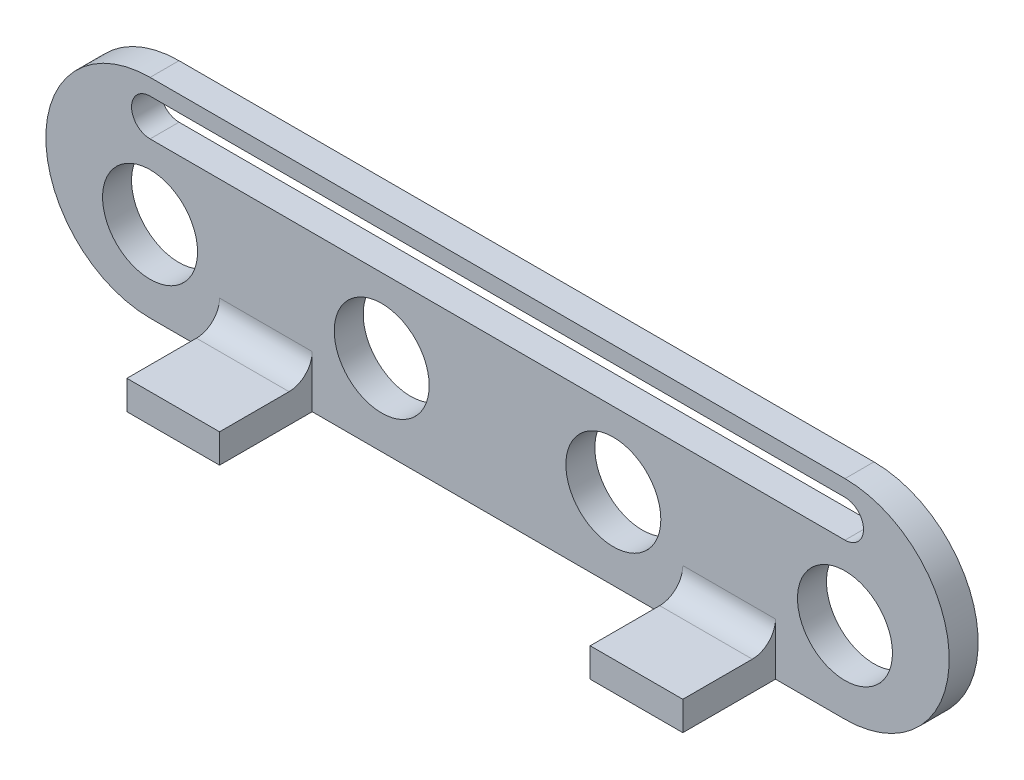
ISO-10303-21;
HEADER;
FILE_DESCRIPTION(('STEP AP214'),'2;1');
FILE_NAME('part.step','',(''),(''),'','','');
FILE_SCHEMA(('AUTOMOTIVE_DESIGN { 1 0 10303 214 1 1 1 1 }'));
ENDSEC;
DATA;
#1=APPLICATION_CONTEXT('core data for automotive mechanical design processes');
#2=APPLICATION_PROTOCOL_DEFINITION('international standard','automotive_design',2000,#1);
#3=PRODUCT_CONTEXT('',#1,'mechanical');
#4=PRODUCT('Part','Part','',(#3));
#5=PRODUCT_RELATED_PRODUCT_CATEGORY('part','',(#4));
#6=PRODUCT_DEFINITION_FORMATION('','',#4);
#7=PRODUCT_DEFINITION_CONTEXT('part definition',#1,'design');
#8=PRODUCT_DEFINITION('design','',#6,#7);
#9=PRODUCT_DEFINITION_SHAPE('','',#8);
#10=(LENGTH_UNIT() NAMED_UNIT(*) SI_UNIT(.MILLI.,.METRE.));
#11=(NAMED_UNIT(*) PLANE_ANGLE_UNIT() SI_UNIT($,.RADIAN.));
#12=(NAMED_UNIT(*) SI_UNIT($,.STERADIAN.) SOLID_ANGLE_UNIT());
#13=UNCERTAINTY_MEASURE_WITH_UNIT(LENGTH_MEASURE(1.E-05),#10,'distance_accuracy_value','');
#14=(GEOMETRIC_REPRESENTATION_CONTEXT(3) GLOBAL_UNCERTAINTY_ASSIGNED_CONTEXT((#13)) GLOBAL_UNIT_ASSIGNED_CONTEXT((#10,
#11,#12)) REPRESENTATION_CONTEXT('',''));
#15=CARTESIAN_POINT('',(0.,0.,0.));
#16=DIRECTION('',(0.,0.,1.));
#17=DIRECTION('',(1.,0.,0.));
#18=AXIS2_PLACEMENT_3D('',#15,#16,#17);
#19=CARTESIAN_POINT('',(-38.1,0.,3.175));
#20=DIRECTION('',(0.,0.,1.));
#21=DIRECTION('',(1.,0.,0.));
#22=AXIS2_PLACEMENT_3D('',#19,#20,#21);
#23=PLANE('',#22);
#24=CARTESIAN_POINT('',(-38.1,7.62,3.175));
#25=DIRECTION('',(0.,0.,1.));
#26=DIRECTION('',(1.,0.,0.));
#27=AXIS2_PLACEMENT_3D('',#24,#25,#26);
#28=CIRCLE('',#27,2.032);
#29=CARTESIAN_POINT('',(-38.1,9.652,3.175));
#30=VERTEX_POINT('',#29);
#31=CARTESIAN_POINT('',(-38.1,5.588,3.175));
#32=VERTEX_POINT('',#31);
#33=EDGE_CURVE('E48',#30,#32,#28,.T.);
#34=ORIENTED_EDGE('',*,*,#33,.F.);
#35=DIRECTION('',(-1.,0.,0.));
#36=VECTOR('',#35,1.);
#37=CARTESIAN_POINT('',(-38.1,9.652,3.175));
#38=LINE('',#37,#36);
#39=CARTESIAN_POINT('',(38.1,9.652,3.175));
#40=VERTEX_POINT('',#39);
#41=EDGE_CURVE('E165',#40,#30,#38,.T.);
#42=ORIENTED_EDGE('',*,*,#41,.F.);
#43=CARTESIAN_POINT('',(38.1,7.62,3.175));
#44=DIRECTION('',(0.,0.,1.));
#45=DIRECTION('',(1.,0.,0.));
#46=AXIS2_PLACEMENT_3D('',#43,#44,#45);
#47=CIRCLE('',#46,2.032);
#48=CARTESIAN_POINT('',(38.1,5.588,3.175));
#49=VERTEX_POINT('',#48);
#50=EDGE_CURVE('E185',#49,#40,#47,.T.);
#51=ORIENTED_EDGE('',*,*,#50,.F.);
#52=DIRECTION('',(1.,0.,0.));
#53=VECTOR('',#52,1.);
#54=CARTESIAN_POINT('',(-38.1,5.588,3.175));
#55=LINE('',#54,#53);
#56=EDGE_CURVE('E179',#32,#49,#55,.T.);
#57=ORIENTED_EDGE('',*,*,#56,.F.);
#58=EDGE_LOOP('',(#34,#42,#51,#57));
#59=FACE_BOUND('',#58,.T.);
#60=CARTESIAN_POINT('',(12.7,-2.54,3.175));
#61=DIRECTION('',(0.,0.,1.));
#62=DIRECTION('',(1.,0.,0.));
#63=AXIS2_PLACEMENT_3D('',#60,#61,#62);
#64=CIRCLE('',#63,5.207);
#65=CARTESIAN_POINT('',(17.907,-2.54,3.175));
#66=VERTEX_POINT('',#65);
#67=EDGE_CURVE('E252',#66,#66,#64,.T.);
#68=ORIENTED_EDGE('',*,*,#67,.F.);
#69=EDGE_LOOP('',(#68));
#70=FACE_BOUND('',#69,.T.);
#71=CARTESIAN_POINT('',(-38.1,-2.54,3.175));
#72=DIRECTION('',(0.,0.,1.));
#73=DIRECTION('',(1.,0.,0.));
#74=AXIS2_PLACEMENT_3D('',#71,#72,#73);
#75=CIRCLE('',#74,5.207);
#76=CARTESIAN_POINT('',(-32.893,-2.54,3.175));
#77=VERTEX_POINT('',#76);
#78=EDGE_CURVE('E264',#77,#77,#75,.T.);
#79=ORIENTED_EDGE('',*,*,#78,.F.);
#80=EDGE_LOOP('',(#79));
#81=FACE_BOUND('',#80,.T.);
#82=CARTESIAN_POINT('',(-12.7,-2.54,3.175));
#83=DIRECTION('',(0.,0.,1.));
#84=DIRECTION('',(1.,0.,0.));
#85=AXIS2_PLACEMENT_3D('',#82,#83,#84);
#86=CIRCLE('',#85,5.207);
#87=CARTESIAN_POINT('',(-7.49300000000001,-2.54,3.175));
#88=VERTEX_POINT('',#87);
#89=EDGE_CURVE('E258',#88,#88,#86,.T.);
#90=ORIENTED_EDGE('',*,*,#89,.F.);
#91=EDGE_LOOP('',(#90));
#92=FACE_BOUND('',#91,.T.);
#93=CARTESIAN_POINT('',(38.1,-2.54,3.175));
#94=DIRECTION('',(0.,0.,1.));
#95=DIRECTION('',(1.,0.,0.));
#96=AXIS2_PLACEMENT_3D('',#93,#94,#95);
#97=CIRCLE('',#96,5.207);
#98=CARTESIAN_POINT('',(43.307,-2.54,3.175));
#99=VERTEX_POINT('',#98);
#100=EDGE_CURVE('E246',#99,#99,#97,.T.);
#101=ORIENTED_EDGE('',*,*,#100,.F.);
#102=EDGE_LOOP('',(#101));
#103=FACE_BOUND('',#102,.T.);
#104=DIRECTION('',(0.,-1.,0.));
#105=VECTOR('',#104,1.);
#106=CARTESIAN_POINT('',(20.32,-8.255,3.175));
#107=LINE('',#106,#105);
#108=CARTESIAN_POINT('',(20.32,-5.715,3.175));
#109=VERTEX_POINT('',#108);
#110=CARTESIAN_POINT('',(20.32,-11.43,3.175));
#111=VERTEX_POINT('',#110);
#112=EDGE_CURVE('E224',#109,#111,#107,.T.);
#113=ORIENTED_EDGE('',*,*,#112,.F.);
#114=DIRECTION('',(-1.,0.,0.));
#115=VECTOR('',#114,1.);
#116=CARTESIAN_POINT('',(-38.1,-5.71499999999999,3.175));
#117=LINE('',#116,#115);
#118=CARTESIAN_POINT('',(30.48,-5.715,3.175));
#119=VERTEX_POINT('',#118);
#120=EDGE_CURVE('E307',#109,#119,#117,.F.);
#121=ORIENTED_EDGE('',*,*,#120,.T.);
#122=DIRECTION('',(0.,1.,0.));
#123=VECTOR('',#122,1.);
#124=CARTESIAN_POINT('',(30.48,-8.255,3.175));
#125=LINE('',#124,#123);
#126=CARTESIAN_POINT('',(30.48,-11.43,3.175));
#127=VERTEX_POINT('',#126);
#128=EDGE_CURVE('E219',#127,#119,#125,.T.);
#129=ORIENTED_EDGE('',*,*,#128,.F.);
#130=DIRECTION('',(1.,0.,0.));
#131=VECTOR('',#130,1.);
#132=CARTESIAN_POINT('',(-38.1,-11.43,3.175));
#133=LINE('',#132,#131);
#134=CARTESIAN_POINT('',(38.1,-11.43,3.175));
#135=VERTEX_POINT('',#134);
#136=EDGE_CURVE('E273',#127,#135,#133,.T.);
#137=ORIENTED_EDGE('',*,*,#136,.T.);
#138=CARTESIAN_POINT('',(38.1,0.,3.175));
#139=DIRECTION('',(0.,0.,1.));
#140=DIRECTION('',(1.,0.,0.));
#141=AXIS2_PLACEMENT_3D('',#138,#139,#140);
#142=CIRCLE('',#141,11.43);
#143=CARTESIAN_POINT('',(38.1,11.43,3.175));
#144=VERTEX_POINT('',#143);
#145=EDGE_CURVE('E277',#135,#144,#142,.T.);
#146=ORIENTED_EDGE('',*,*,#145,.T.);
#147=DIRECTION('',(-1.,0.,0.));
#148=VECTOR('',#147,1.);
#149=CARTESIAN_POINT('',(-38.1,11.43,3.175));
#150=LINE('',#149,#148);
#151=CARTESIAN_POINT('',(-38.1,11.43,3.175));
#152=VERTEX_POINT('',#151);
#153=EDGE_CURVE('E280',#144,#152,#150,.T.);
#154=ORIENTED_EDGE('',*,*,#153,.T.);
#155=CARTESIAN_POINT('',(-38.1,0.,3.175));
#156=DIRECTION('',(0.,0.,1.));
#157=DIRECTION('',(1.,0.,0.));
#158=AXIS2_PLACEMENT_3D('',#155,#156,#157);
#159=CIRCLE('',#158,11.43);
#160=CARTESIAN_POINT('',(-38.1,-11.43,3.175));
#161=VERTEX_POINT('',#160);
#162=EDGE_CURVE('E270',#152,#161,#159,.T.);
#163=ORIENTED_EDGE('',*,*,#162,.T.);
#164=CARTESIAN_POINT('',(-30.48,-11.43,3.175));
#165=VERTEX_POINT('',#164);
#166=EDGE_CURVE('E275',#161,#165,#133,.T.);
#167=ORIENTED_EDGE('',*,*,#166,.T.);
#168=DIRECTION('',(0.,-1.,0.));
#169=VECTOR('',#168,1.);
#170=CARTESIAN_POINT('',(-30.48,-8.255,3.175));
#171=LINE('',#170,#169);
#172=CARTESIAN_POINT('',(-30.48,-5.715,3.175));
#173=VERTEX_POINT('',#172);
#174=EDGE_CURVE('E171',#173,#165,#171,.T.);
#175=ORIENTED_EDGE('',*,*,#174,.F.);
#176=DIRECTION('',(-1.,0.,0.));
#177=VECTOR('',#176,1.);
#178=CARTESIAN_POINT('',(-38.1,-5.715,3.175));
#179=LINE('',#178,#177);
#180=CARTESIAN_POINT('',(-20.32,-5.715,3.175));
#181=VERTEX_POINT('',#180);
#182=EDGE_CURVE('E304',#173,#181,#179,.F.);
#183=ORIENTED_EDGE('',*,*,#182,.T.);
#184=DIRECTION('',(0.,1.,0.));
#185=VECTOR('',#184,1.);
#186=CARTESIAN_POINT('',(-20.32,-8.255,3.175));
#187=LINE('',#186,#185);
#188=CARTESIAN_POINT('',(-20.32,-11.43,3.175));
#189=VERTEX_POINT('',#188);
#190=EDGE_CURVE('E198',#189,#181,#187,.T.);
#191=ORIENTED_EDGE('',*,*,#190,.F.);
#192=EDGE_CURVE('E278',#189,#111,#133,.T.);
#193=ORIENTED_EDGE('',*,*,#192,.T.);
#194=EDGE_LOOP('',(#113,#121,#129,#137,#146,#154,#163,#167,#175,#183,#191,#193));
#195=FACE_BOUND('',#194,.T.);
#196=ADVANCED_FACE('F33',(#59,#70,#81,#92,#103,#195),#23,.T.);
#197=CARTESIAN_POINT('',(-38.1,0.,0.));
#198=DIRECTION('',(0.,0.,1.));
#199=DIRECTION('',(1.,0.,0.));
#200=AXIS2_PLACEMENT_3D('',#197,#198,#199);
#201=PLANE('',#200);
#202=DIRECTION('',(1.,0.,0.));
#203=VECTOR('',#202,1.);
#204=CARTESIAN_POINT('',(-38.1,9.652,0.));
#205=LINE('',#204,#203);
#206=CARTESIAN_POINT('',(-38.1,9.652,0.));
#207=VERTEX_POINT('',#206);
#208=CARTESIAN_POINT('',(38.1,9.652,0.));
#209=VERTEX_POINT('',#208);
#210=EDGE_CURVE('E177',#207,#209,#205,.T.);
#211=ORIENTED_EDGE('',*,*,#210,.F.);
#212=CARTESIAN_POINT('',(-38.1,7.62,0.));
#213=DIRECTION('',(0.,0.,1.));
#214=DIRECTION('',(1.,0.,0.));
#215=AXIS2_PLACEMENT_3D('',#212,#213,#214);
#216=CIRCLE('',#215,2.032);
#217=CARTESIAN_POINT('',(-38.1,5.588,0.));
#218=VERTEX_POINT('',#217);
#219=EDGE_CURVE('E159',#218,#207,#216,.F.);
#220=ORIENTED_EDGE('',*,*,#219,.F.);
#221=DIRECTION('',(-1.,0.,0.));
#222=VECTOR('',#221,1.);
#223=CARTESIAN_POINT('',(-38.1,5.588,0.));
#224=LINE('',#223,#222);
#225=CARTESIAN_POINT('',(38.1,5.588,0.));
#226=VERTEX_POINT('',#225);
#227=EDGE_CURVE('E168',#226,#218,#224,.T.);
#228=ORIENTED_EDGE('',*,*,#227,.F.);
#229=CARTESIAN_POINT('',(38.1,7.62,0.));
#230=DIRECTION('',(0.,0.,1.));
#231=DIRECTION('',(1.,0.,0.));
#232=AXIS2_PLACEMENT_3D('',#229,#230,#231);
#233=CIRCLE('',#232,2.032);
#234=EDGE_CURVE('E56',#209,#226,#233,.F.);
#235=ORIENTED_EDGE('',*,*,#234,.F.);
#236=EDGE_LOOP('',(#211,#220,#228,#235));
#237=FACE_BOUND('',#236,.T.);
#238=CARTESIAN_POINT('',(-38.1,0.,0.));
#239=DIRECTION('',(0.,0.,1.));
#240=DIRECTION('',(1.,0.,0.));
#241=AXIS2_PLACEMENT_3D('',#238,#239,#240);
#242=CIRCLE('',#241,11.43);
#243=CARTESIAN_POINT('',(-38.1,11.43,0.));
#244=VERTEX_POINT('',#243);
#245=CARTESIAN_POINT('',(-38.1,-11.43,0.));
#246=VERTEX_POINT('',#245);
#247=EDGE_CURVE('E267',#244,#246,#242,.T.);
#248=ORIENTED_EDGE('',*,*,#247,.F.);
#249=DIRECTION('',(-1.,0.,0.));
#250=VECTOR('',#249,1.);
#251=CARTESIAN_POINT('',(-38.1,11.43,0.));
#252=LINE('',#251,#250);
#253=CARTESIAN_POINT('',(38.1,11.43,0.));
#254=VERTEX_POINT('',#253);
#255=EDGE_CURVE('E274',#254,#244,#252,.T.);
#256=ORIENTED_EDGE('',*,*,#255,.F.);
#257=CARTESIAN_POINT('',(38.1,0.,0.));
#258=DIRECTION('',(0.,0.,1.));
#259=DIRECTION('',(1.,0.,0.));
#260=AXIS2_PLACEMENT_3D('',#257,#258,#259);
#261=CIRCLE('',#260,11.43);
#262=CARTESIAN_POINT('',(38.1,-11.43,0.));
#263=VERTEX_POINT('',#262);
#264=EDGE_CURVE('E287',#263,#254,#261,.T.);
#265=ORIENTED_EDGE('',*,*,#264,.F.);
#266=DIRECTION('',(1.,0.,0.));
#267=VECTOR('',#266,1.);
#268=CARTESIAN_POINT('',(-38.1,-11.43,0.));
#269=LINE('',#268,#267);
#270=EDGE_CURVE('E285',#246,#263,#269,.T.);
#271=ORIENTED_EDGE('',*,*,#270,.F.);
#272=EDGE_LOOP('',(#248,#256,#265,#271));
#273=FACE_BOUND('',#272,.T.);
#274=CARTESIAN_POINT('',(-38.1,-2.54,0.));
#275=DIRECTION('',(0.,0.,1.));
#276=DIRECTION('',(1.,0.,0.));
#277=AXIS2_PLACEMENT_3D('',#274,#275,#276);
#278=CIRCLE('',#277,5.207);
#279=CARTESIAN_POINT('',(-32.893,-2.54,0.));
#280=VERTEX_POINT('',#279);
#281=EDGE_CURVE('E261',#280,#280,#278,.T.);
#282=ORIENTED_EDGE('',*,*,#281,.T.);
#283=EDGE_LOOP('',(#282));
#284=FACE_BOUND('',#283,.T.);
#285=CARTESIAN_POINT('',(-12.7,-2.54,0.));
#286=DIRECTION('',(0.,0.,1.));
#287=DIRECTION('',(1.,0.,0.));
#288=AXIS2_PLACEMENT_3D('',#285,#286,#287);
#289=CIRCLE('',#288,5.207);
#290=CARTESIAN_POINT('',(-7.49300000000001,-2.54,0.));
#291=VERTEX_POINT('',#290);
#292=EDGE_CURVE('E255',#291,#291,#289,.T.);
#293=ORIENTED_EDGE('',*,*,#292,.T.);
#294=EDGE_LOOP('',(#293));
#295=FACE_BOUND('',#294,.T.);
#296=CARTESIAN_POINT('',(12.7,-2.54,0.));
#297=DIRECTION('',(0.,0.,1.));
#298=DIRECTION('',(1.,0.,0.));
#299=AXIS2_PLACEMENT_3D('',#296,#297,#298);
#300=CIRCLE('',#299,5.207);
#301=CARTESIAN_POINT('',(17.907,-2.54,0.));
#302=VERTEX_POINT('',#301);
#303=EDGE_CURVE('E249',#302,#302,#300,.T.);
#304=ORIENTED_EDGE('',*,*,#303,.T.);
#305=EDGE_LOOP('',(#304));
#306=FACE_BOUND('',#305,.T.);
#307=CARTESIAN_POINT('',(38.1,-2.54,0.));
#308=DIRECTION('',(0.,0.,1.));
#309=DIRECTION('',(1.,0.,0.));
#310=AXIS2_PLACEMENT_3D('',#307,#308,#309);
#311=CIRCLE('',#310,5.207);
#312=CARTESIAN_POINT('',(43.307,-2.54,0.));
#313=VERTEX_POINT('',#312);
#314=EDGE_CURVE('E245',#313,#313,#311,.T.);
#315=ORIENTED_EDGE('',*,*,#314,.T.);
#316=EDGE_LOOP('',(#315));
#317=FACE_BOUND('',#316,.T.);
#318=ADVANCED_FACE('F174',(#237,#273,#284,#295,#306,#317),#201,.F.);
#319=CARTESIAN_POINT('',(-38.1,0.,3.175));
#320=DIRECTION('',(0.,0.,-1.));
#321=DIRECTION('',(-1.,0.,0.));
#322=AXIS2_PLACEMENT_3D('',#319,#320,#321);
#323=CYLINDRICAL_SURFACE('',#322,11.43);
#324=ORIENTED_EDGE('',*,*,#247,.T.);
#325=DIRECTION('',(0.,0.,-1.));
#326=VECTOR('',#325,1.);
#327=CARTESIAN_POINT('',(-38.1,-11.43,3.175));
#328=LINE('',#327,#326);
#329=EDGE_CURVE('E298',#161,#246,#328,.T.);
#330=ORIENTED_EDGE('',*,*,#329,.F.);
#331=ORIENTED_EDGE('',*,*,#162,.F.);
#332=DIRECTION('',(0.,0.,-1.));
#333=VECTOR('',#332,1.);
#334=CARTESIAN_POINT('',(-38.1,11.43,3.175));
#335=LINE('',#334,#333);
#336=EDGE_CURVE('E282',#152,#244,#335,.T.);
#337=ORIENTED_EDGE('',*,*,#336,.T.);
#338=EDGE_LOOP('',(#324,#330,#331,#337));
#339=FACE_BOUND('',#338,.T.);
#340=ADVANCED_FACE('F360',(#339),#323,.T.);
#341=CARTESIAN_POINT('',(-38.1,-11.43,3.175));
#342=DIRECTION('',(0.,1.,0.));
#343=DIRECTION('',(0.,0.,1.));
#344=AXIS2_PLACEMENT_3D('',#341,#342,#343);
#345=PLANE('',#344);
#346=ORIENTED_EDGE('',*,*,#270,.T.);
#347=DIRECTION('',(0.,0.,-1.));
#348=VECTOR('',#347,1.);
#349=CARTESIAN_POINT('',(38.1,-11.43,3.175));
#350=LINE('',#349,#348);
#351=EDGE_CURVE('E295',#135,#263,#350,.T.);
#352=ORIENTED_EDGE('',*,*,#351,.F.);
#353=ORIENTED_EDGE('',*,*,#136,.F.);
#354=DIRECTION('',(0.,0.,-1.));
#355=VECTOR('',#354,1.);
#356=CARTESIAN_POINT('',(30.48,-11.43,13.335));
#357=LINE('',#356,#355);
#358=CARTESIAN_POINT('',(30.48,-11.43,13.335));
#359=VERTEX_POINT('',#358);
#360=EDGE_CURVE('E230',#359,#127,#357,.T.);
#361=ORIENTED_EDGE('',*,*,#360,.F.);
#362=DIRECTION('',(1.,0.,0.));
#363=VECTOR('',#362,1.);
#364=CARTESIAN_POINT('',(30.48,-11.43,13.335));
#365=LINE('',#364,#363);
#366=CARTESIAN_POINT('',(20.32,-11.43,13.335));
#367=VERTEX_POINT('',#366);
#368=EDGE_CURVE('E228',#367,#359,#365,.T.);
#369=ORIENTED_EDGE('',*,*,#368,.F.);
#370=DIRECTION('',(0.,0.,-1.));
#371=VECTOR('',#370,1.);
#372=CARTESIAN_POINT('',(20.32,-11.43,13.335));
#373=LINE('',#372,#371);
#374=EDGE_CURVE('E236',#367,#111,#373,.T.);
#375=ORIENTED_EDGE('',*,*,#374,.T.);
#376=ORIENTED_EDGE('',*,*,#192,.F.);
#377=DIRECTION('',(0.,0.,-1.));
#378=VECTOR('',#377,1.);
#379=CARTESIAN_POINT('',(-20.32,-11.43,13.335));
#380=LINE('',#379,#378);
#381=CARTESIAN_POINT('',(-20.32,-11.43,13.335));
#382=VERTEX_POINT('',#381);
#383=EDGE_CURVE('E213',#382,#189,#380,.T.);
#384=ORIENTED_EDGE('',*,*,#383,.F.);
#385=DIRECTION('',(1.,0.,0.));
#386=VECTOR('',#385,1.);
#387=CARTESIAN_POINT('',(-30.48,-11.43,13.335));
#388=LINE('',#387,#386);
#389=CARTESIAN_POINT('',(-30.48,-11.43,13.335));
#390=VERTEX_POINT('',#389);
#391=EDGE_CURVE('E197',#390,#382,#388,.T.);
#392=ORIENTED_EDGE('',*,*,#391,.F.);
#393=DIRECTION('',(0.,0.,-1.));
#394=VECTOR('',#393,1.);
#395=CARTESIAN_POINT('',(-30.48,-11.43,13.335));
#396=LINE('',#395,#394);
#397=EDGE_CURVE('E216',#390,#165,#396,.T.);
#398=ORIENTED_EDGE('',*,*,#397,.T.);
#399=ORIENTED_EDGE('',*,*,#166,.F.);
#400=ORIENTED_EDGE('',*,*,#329,.T.);
#401=EDGE_LOOP('',(#346,#352,#353,#361,#369,#375,#376,#384,#392,#398,#399,#400));
#402=FACE_BOUND('',#401,.T.);
#403=ADVANCED_FACE('F332',(#402),#345,.F.);
#404=CARTESIAN_POINT('',(38.1,0.,3.175));
#405=DIRECTION('',(0.,0.,-1.));
#406=DIRECTION('',(-1.,0.,0.));
#407=AXIS2_PLACEMENT_3D('',#404,#405,#406);
#408=CYLINDRICAL_SURFACE('',#407,11.43);
#409=ORIENTED_EDGE('',*,*,#264,.T.);
#410=DIRECTION('',(0.,0.,-1.));
#411=VECTOR('',#410,1.);
#412=CARTESIAN_POINT('',(38.1,11.43,3.175));
#413=LINE('',#412,#411);
#414=EDGE_CURVE('E292',#144,#254,#413,.T.);
#415=ORIENTED_EDGE('',*,*,#414,.F.);
#416=ORIENTED_EDGE('',*,*,#145,.F.);
#417=ORIENTED_EDGE('',*,*,#351,.T.);
#418=EDGE_LOOP('',(#409,#415,#416,#417));
#419=FACE_BOUND('',#418,.T.);
#420=ADVANCED_FACE('F352',(#419),#408,.T.);
#421=CARTESIAN_POINT('',(-38.1,11.43,3.175));
#422=DIRECTION('',(0.,-1.,0.));
#423=DIRECTION('',(0.,0.,-1.));
#424=AXIS2_PLACEMENT_3D('',#421,#422,#423);
#425=PLANE('',#424);
#426=ORIENTED_EDGE('',*,*,#255,.T.);
#427=ORIENTED_EDGE('',*,*,#336,.F.);
#428=ORIENTED_EDGE('',*,*,#153,.F.);
#429=ORIENTED_EDGE('',*,*,#414,.T.);
#430=EDGE_LOOP('',(#426,#427,#428,#429));
#431=FACE_BOUND('',#430,.T.);
#432=ADVANCED_FACE('F357',(#431),#425,.F.);
#433=CARTESIAN_POINT('',(-38.1,-2.54,3.175));
#434=DIRECTION('',(0.,0.,-1.));
#435=DIRECTION('',(-1.,0.,0.));
#436=AXIS2_PLACEMENT_3D('',#433,#434,#435);
#437=CYLINDRICAL_SURFACE('',#436,5.207);
#438=ORIENTED_EDGE('',*,*,#78,.T.);
#439=EDGE_LOOP('',(#438));
#440=FACE_BOUND('',#439,.T.);
#441=ORIENTED_EDGE('',*,*,#281,.F.);
#442=EDGE_LOOP('',(#441));
#443=FACE_BOUND('',#442,.T.);
#444=ADVANCED_FACE('F395',(#440,#443),#437,.F.);
#445=CARTESIAN_POINT('',(-12.7,-2.54,3.175));
#446=DIRECTION('',(0.,0.,-1.));
#447=DIRECTION('',(-1.,0.,0.));
#448=AXIS2_PLACEMENT_3D('',#445,#446,#447);
#449=CYLINDRICAL_SURFACE('',#448,5.207);
#450=ORIENTED_EDGE('',*,*,#89,.T.);
#451=EDGE_LOOP('',(#450));
#452=FACE_BOUND('',#451,.T.);
#453=ORIENTED_EDGE('',*,*,#292,.F.);
#454=EDGE_LOOP('',(#453));
#455=FACE_BOUND('',#454,.T.);
#456=ADVANCED_FACE('F385',(#452,#455),#449,.F.);
#457=CARTESIAN_POINT('',(12.7,-2.54,3.175));
#458=DIRECTION('',(0.,0.,-1.));
#459=DIRECTION('',(-1.,0.,0.));
#460=AXIS2_PLACEMENT_3D('',#457,#458,#459);
#461=CYLINDRICAL_SURFACE('',#460,5.207);
#462=ORIENTED_EDGE('',*,*,#67,.T.);
#463=EDGE_LOOP('',(#462));
#464=FACE_BOUND('',#463,.T.);
#465=ORIENTED_EDGE('',*,*,#303,.F.);
#466=EDGE_LOOP('',(#465));
#467=FACE_BOUND('',#466,.T.);
#468=ADVANCED_FACE('F375',(#464,#467),#461,.F.);
#469=CARTESIAN_POINT('',(38.1,-2.54,3.175));
#470=DIRECTION('',(0.,0.,-1.));
#471=DIRECTION('',(-1.,0.,0.));
#472=AXIS2_PLACEMENT_3D('',#469,#470,#471);
#473=CYLINDRICAL_SURFACE('',#472,5.207);
#474=ORIENTED_EDGE('',*,*,#100,.T.);
#475=EDGE_LOOP('',(#474));
#476=FACE_BOUND('',#475,.T.);
#477=ORIENTED_EDGE('',*,*,#314,.F.);
#478=EDGE_LOOP('',(#477));
#479=FACE_BOUND('',#478,.T.);
#480=ADVANCED_FACE('F372',(#476,#479),#473,.F.);
#481=CARTESIAN_POINT('',(30.48,-8.255,13.335));
#482=DIRECTION('',(-1.,0.,0.));
#483=DIRECTION('',(0.,0.,1.));
#484=AXIS2_PLACEMENT_3D('',#481,#482,#483);
#485=PLANE('',#484);
#486=ORIENTED_EDGE('',*,*,#128,.T.);
#487=CARTESIAN_POINT('',(30.48,-5.715,5.715));
#488=DIRECTION('',(-1.,0.,0.));
#489=DIRECTION('',(0.,0.,1.));
#490=AXIS2_PLACEMENT_3D('',#487,#488,#489);
#491=CIRCLE('',#490,2.54);
#492=CARTESIAN_POINT('',(30.48,-8.255,5.715));
#493=VERTEX_POINT('',#492);
#494=EDGE_CURVE('E316',#119,#493,#491,.T.);
#495=ORIENTED_EDGE('',*,*,#494,.T.);
#496=DIRECTION('',(0.,0.,-1.));
#497=VECTOR('',#496,1.);
#498=CARTESIAN_POINT('',(30.48,-8.255,13.335));
#499=LINE('',#498,#497);
#500=CARTESIAN_POINT('',(30.48,-8.255,13.335));
#501=VERTEX_POINT('',#500);
#502=EDGE_CURVE('E242',#501,#493,#499,.T.);
#503=ORIENTED_EDGE('',*,*,#502,.F.);
#504=DIRECTION('',(0.,1.,0.));
#505=VECTOR('',#504,1.);
#506=CARTESIAN_POINT('',(30.48,-8.255,13.335));
#507=LINE('',#506,#505);
#508=EDGE_CURVE('E220',#359,#501,#507,.T.);
#509=ORIENTED_EDGE('',*,*,#508,.F.);
#510=ORIENTED_EDGE('',*,*,#360,.T.);
#511=EDGE_LOOP('',(#486,#495,#503,#509,#510));
#512=FACE_BOUND('',#511,.T.);
#513=ADVANCED_FACE('F374',(#512),#485,.F.);
#514=CARTESIAN_POINT('',(30.48,-8.255,13.335));
#515=DIRECTION('',(0.,-1.,0.));
#516=DIRECTION('',(1.,0.,0.));
#517=AXIS2_PLACEMENT_3D('',#514,#515,#516);
#518=PLANE('',#517);
#519=ORIENTED_EDGE('',*,*,#502,.T.);
#520=DIRECTION('',(-1.,0.,0.));
#521=VECTOR('',#520,1.);
#522=CARTESIAN_POINT('',(30.48,-8.255,5.715));
#523=LINE('',#522,#521);
#524=CARTESIAN_POINT('',(20.32,-8.255,5.715));
#525=VERTEX_POINT('',#524);
#526=EDGE_CURVE('E301',#493,#525,#523,.T.);
#527=ORIENTED_EDGE('',*,*,#526,.T.);
#528=DIRECTION('',(0.,0.,-1.));
#529=VECTOR('',#528,1.);
#530=CARTESIAN_POINT('',(20.32,-8.255,13.335));
#531=LINE('',#530,#529);
#532=CARTESIAN_POINT('',(20.32,-8.255,13.335));
#533=VERTEX_POINT('',#532);
#534=EDGE_CURVE('E239',#533,#525,#531,.T.);
#535=ORIENTED_EDGE('',*,*,#534,.F.);
#536=DIRECTION('',(-1.,0.,0.));
#537=VECTOR('',#536,1.);
#538=CARTESIAN_POINT('',(30.48,-8.255,13.335));
#539=LINE('',#538,#537);
#540=EDGE_CURVE('E223',#501,#533,#539,.T.);
#541=ORIENTED_EDGE('',*,*,#540,.F.);
#542=EDGE_LOOP('',(#519,#527,#535,#541));
#543=FACE_BOUND('',#542,.T.);
#544=ADVANCED_FACE('F382',(#543),#518,.F.);
#545=CARTESIAN_POINT('',(20.32,-8.255,13.335));
#546=DIRECTION('',(1.,0.,0.));
#547=DIRECTION('',(0.,1.,0.));
#548=AXIS2_PLACEMENT_3D('',#545,#546,#547);
#549=PLANE('',#548);
#550=ORIENTED_EDGE('',*,*,#112,.T.);
#551=ORIENTED_EDGE('',*,*,#374,.F.);
#552=DIRECTION('',(0.,-1.,0.));
#553=VECTOR('',#552,1.);
#554=CARTESIAN_POINT('',(20.32,-8.255,13.335));
#555=LINE('',#554,#553);
#556=EDGE_CURVE('E226',#533,#367,#555,.T.);
#557=ORIENTED_EDGE('',*,*,#556,.F.);
#558=ORIENTED_EDGE('',*,*,#534,.T.);
#559=CARTESIAN_POINT('',(20.32,-5.715,5.715));
#560=DIRECTION('',(1.,0.,0.));
#561=DIRECTION('',(0.,1.,0.));
#562=AXIS2_PLACEMENT_3D('',#559,#560,#561);
#563=CIRCLE('',#562,2.54);
#564=EDGE_CURVE('E313',#525,#109,#563,.T.);
#565=ORIENTED_EDGE('',*,*,#564,.T.);
#566=EDGE_LOOP('',(#550,#551,#557,#558,#565));
#567=FACE_BOUND('',#566,.T.);
#568=ADVANCED_FACE('F424',(#567),#549,.F.);
#569=CARTESIAN_POINT('',(0.,0.,13.335));
#570=DIRECTION('',(0.,0.,-1.));
#571=DIRECTION('',(-1.,0.,0.));
#572=AXIS2_PLACEMENT_3D('',#569,#570,#571);
#573=PLANE('',#572);
#574=ORIENTED_EDGE('',*,*,#508,.T.);
#575=ORIENTED_EDGE('',*,*,#540,.T.);
#576=ORIENTED_EDGE('',*,*,#556,.T.);
#577=ORIENTED_EDGE('',*,*,#368,.T.);
#578=EDGE_LOOP('',(#574,#575,#576,#577));
#579=FACE_BOUND('',#578,.T.);
#580=ADVANCED_FACE('F422',(#579),#573,.F.);
#581=CARTESIAN_POINT('',(-30.48,-8.255,13.335));
#582=DIRECTION('',(1.,0.,0.));
#583=DIRECTION('',(0.,0.,-1.));
#584=AXIS2_PLACEMENT_3D('',#581,#582,#583);
#585=PLANE('',#584);
#586=ORIENTED_EDGE('',*,*,#174,.T.);
#587=ORIENTED_EDGE('',*,*,#397,.F.);
#588=DIRECTION('',(0.,-1.,0.));
#589=VECTOR('',#588,1.);
#590=CARTESIAN_POINT('',(-30.48,-8.255,13.335));
#591=LINE('',#590,#589);
#592=CARTESIAN_POINT('',(-30.48,-8.255,13.335));
#593=VERTEX_POINT('',#592);
#594=EDGE_CURVE('E194',#593,#390,#591,.T.);
#595=ORIENTED_EDGE('',*,*,#594,.F.);
#596=DIRECTION('',(0.,0.,-1.));
#597=VECTOR('',#596,1.);
#598=CARTESIAN_POINT('',(-30.48,-8.255,13.335));
#599=LINE('',#598,#597);
#600=CARTESIAN_POINT('',(-30.48,-8.255,5.715));
#601=VERTEX_POINT('',#600);
#602=EDGE_CURVE('E204',#593,#601,#599,.T.);
#603=ORIENTED_EDGE('',*,*,#602,.T.);
#604=CARTESIAN_POINT('',(-30.48,-5.715,5.715));
#605=DIRECTION('',(1.,0.,0.));
#606=DIRECTION('',(0.,0.,-1.));
#607=AXIS2_PLACEMENT_3D('',#604,#605,#606);
#608=CIRCLE('',#607,2.54);
#609=EDGE_CURVE('E41',#601,#173,#608,.T.);
#610=ORIENTED_EDGE('',*,*,#609,.T.);
#611=EDGE_LOOP('',(#586,#587,#595,#603,#610));
#612=FACE_BOUND('',#611,.T.);
#613=ADVANCED_FACE('F320',(#612),#585,.F.);
#614=CARTESIAN_POINT('',(-20.32,-8.255,13.335));
#615=DIRECTION('',(-1.,0.,0.));
#616=DIRECTION('',(0.,-1.,0.));
#617=AXIS2_PLACEMENT_3D('',#614,#615,#616);
#618=PLANE('',#617);
#619=ORIENTED_EDGE('',*,*,#190,.T.);
#620=CARTESIAN_POINT('',(-20.32,-5.715,5.715));
#621=DIRECTION('',(-1.,0.,0.));
#622=DIRECTION('',(0.,-1.,0.));
#623=AXIS2_PLACEMENT_3D('',#620,#621,#622);
#624=CIRCLE('',#623,2.54);
#625=CARTESIAN_POINT('',(-20.32,-8.255,5.715));
#626=VERTEX_POINT('',#625);
#627=EDGE_CURVE('E11',#181,#626,#624,.T.);
#628=ORIENTED_EDGE('',*,*,#627,.T.);
#629=DIRECTION('',(0.,0.,-1.));
#630=VECTOR('',#629,1.);
#631=CARTESIAN_POINT('',(-20.32,-8.255,13.335));
#632=LINE('',#631,#630);
#633=CARTESIAN_POINT('',(-20.32,-8.255,13.335));
#634=VERTEX_POINT('',#633);
#635=EDGE_CURVE('E210',#634,#626,#632,.T.);
#636=ORIENTED_EDGE('',*,*,#635,.F.);
#637=DIRECTION('',(0.,1.,0.));
#638=VECTOR('',#637,1.);
#639=CARTESIAN_POINT('',(-20.32,-8.255,13.335));
#640=LINE('',#639,#638);
#641=EDGE_CURVE('E200',#382,#634,#640,.T.);
#642=ORIENTED_EDGE('',*,*,#641,.F.);
#643=ORIENTED_EDGE('',*,*,#383,.T.);
#644=EDGE_LOOP('',(#619,#628,#636,#642,#643));
#645=FACE_BOUND('',#644,.T.);
#646=ADVANCED_FACE('F342',(#645),#618,.F.);
#647=CARTESIAN_POINT('',(-30.48,-8.255,13.335));
#648=DIRECTION('',(0.,-1.,0.));
#649=DIRECTION('',(1.,0.,0.));
#650=AXIS2_PLACEMENT_3D('',#647,#648,#649);
#651=PLANE('',#650);
#652=ORIENTED_EDGE('',*,*,#635,.T.);
#653=DIRECTION('',(-1.,0.,0.));
#654=VECTOR('',#653,1.);
#655=CARTESIAN_POINT('',(-30.48,-8.255,5.715));
#656=LINE('',#655,#654);
#657=EDGE_CURVE('E310',#626,#601,#656,.T.);
#658=ORIENTED_EDGE('',*,*,#657,.T.);
#659=ORIENTED_EDGE('',*,*,#602,.F.);
#660=DIRECTION('',(-1.,0.,0.));
#661=VECTOR('',#660,1.);
#662=CARTESIAN_POINT('',(-30.48,-8.255,13.335));
#663=LINE('',#662,#661);
#664=EDGE_CURVE('E202',#634,#593,#663,.T.);
#665=ORIENTED_EDGE('',*,*,#664,.F.);
#666=EDGE_LOOP('',(#652,#658,#659,#665));
#667=FACE_BOUND('',#666,.T.);
#668=ADVANCED_FACE('F340',(#667),#651,.F.);
#669=CARTESIAN_POINT('',(0.,0.,13.335));
#670=DIRECTION('',(0.,0.,1.));
#671=DIRECTION('',(1.,0.,0.));
#672=AXIS2_PLACEMENT_3D('',#669,#670,#671);
#673=PLANE('',#672);
#674=ORIENTED_EDGE('',*,*,#594,.T.);
#675=ORIENTED_EDGE('',*,*,#391,.T.);
#676=ORIENTED_EDGE('',*,*,#641,.T.);
#677=ORIENTED_EDGE('',*,*,#664,.T.);
#678=EDGE_LOOP('',(#674,#675,#676,#677));
#679=FACE_BOUND('',#678,.T.);
#680=ADVANCED_FACE('F335',(#679),#673,.T.);
#681=CARTESIAN_POINT('',(30.48,-5.715,5.715));
#682=DIRECTION('',(-1.,0.,0.));
#683=DIRECTION('',(0.,-1.,0.));
#684=AXIS2_PLACEMENT_3D('',#681,#682,#683);
#685=CYLINDRICAL_SURFACE('',#684,2.54);
#686=ORIENTED_EDGE('',*,*,#494,.F.);
#687=ORIENTED_EDGE('',*,*,#120,.F.);
#688=ORIENTED_EDGE('',*,*,#564,.F.);
#689=ORIENTED_EDGE('',*,*,#526,.F.);
#690=EDGE_LOOP('',(#686,#687,#688,#689));
#691=FACE_BOUND('',#690,.T.);
#692=ADVANCED_FACE('F405',(#691),#685,.F.);
#693=CARTESIAN_POINT('',(-30.48,-5.715,5.715));
#694=DIRECTION('',(-1.,0.,0.));
#695=DIRECTION('',(0.,-1.,0.));
#696=AXIS2_PLACEMENT_3D('',#693,#694,#695);
#697=CYLINDRICAL_SURFACE('',#696,2.54);
#698=ORIENTED_EDGE('',*,*,#627,.F.);
#699=ORIENTED_EDGE('',*,*,#182,.F.);
#700=ORIENTED_EDGE('',*,*,#609,.F.);
#701=ORIENTED_EDGE('',*,*,#657,.F.);
#702=EDGE_LOOP('',(#698,#699,#700,#701));
#703=FACE_BOUND('',#702,.T.);
#704=ADVANCED_FACE('F35',(#703),#697,.F.);
#705=CARTESIAN_POINT('',(-38.1,7.62,-0.00100000000000013));
#706=DIRECTION('',(0.,0.,1.));
#707=DIRECTION('',(1.,0.,0.));
#708=AXIS2_PLACEMENT_3D('',#705,#706,#707);
#709=CYLINDRICAL_SURFACE('',#708,2.032);
#710=ORIENTED_EDGE('',*,*,#219,.T.);
#711=DIRECTION('',(0.,0.,1.));
#712=VECTOR('',#711,1.);
#713=CARTESIAN_POINT('',(-38.1,9.652,-0.00100000000000013));
#714=LINE('',#713,#712);
#715=EDGE_CURVE('E172',#207,#30,#714,.T.);
#716=ORIENTED_EDGE('',*,*,#715,.T.);
#717=ORIENTED_EDGE('',*,*,#33,.T.);
#718=DIRECTION('',(0.,0.,1.));
#719=VECTOR('',#718,1.);
#720=CARTESIAN_POINT('',(-38.1,5.588,-0.00100000000000013));
#721=LINE('',#720,#719);
#722=EDGE_CURVE('E155',#218,#32,#721,.T.);
#723=ORIENTED_EDGE('',*,*,#722,.F.);
#724=EDGE_LOOP('',(#710,#716,#717,#723));
#725=FACE_BOUND('',#724,.T.);
#726=ADVANCED_FACE('F157',(#725),#709,.F.);
#727=CARTESIAN_POINT('',(-38.1,9.652,-0.00100000000000013));
#728=DIRECTION('',(0.,1.,0.));
#729=DIRECTION('',(0.,0.,1.));
#730=AXIS2_PLACEMENT_3D('',#727,#728,#729);
#731=PLANE('',#730);
#732=ORIENTED_EDGE('',*,*,#210,.T.);
#733=DIRECTION('',(0.,0.,1.));
#734=VECTOR('',#733,1.);
#735=CARTESIAN_POINT('',(38.1,9.652,-0.00100000000000013));
#736=LINE('',#735,#734);
#737=EDGE_CURVE('E191',#209,#40,#736,.T.);
#738=ORIENTED_EDGE('',*,*,#737,.T.);
#739=ORIENTED_EDGE('',*,*,#41,.T.);
#740=ORIENTED_EDGE('',*,*,#715,.F.);
#741=EDGE_LOOP('',(#732,#738,#739,#740));
#742=FACE_BOUND('',#741,.T.);
#743=ADVANCED_FACE('F442',(#742),#731,.F.);
#744=CARTESIAN_POINT('',(38.1,7.62,-0.00100000000000013));
#745=DIRECTION('',(0.,0.,1.));
#746=DIRECTION('',(1.,0.,0.));
#747=AXIS2_PLACEMENT_3D('',#744,#745,#746);
#748=CYLINDRICAL_SURFACE('',#747,2.032);
#749=ORIENTED_EDGE('',*,*,#234,.T.);
#750=DIRECTION('',(0.,0.,1.));
#751=VECTOR('',#750,1.);
#752=CARTESIAN_POINT('',(38.1,5.588,-0.00100000000000013));
#753=LINE('',#752,#751);
#754=EDGE_CURVE('E164',#226,#49,#753,.T.);
#755=ORIENTED_EDGE('',*,*,#754,.T.);
#756=ORIENTED_EDGE('',*,*,#50,.T.);
#757=ORIENTED_EDGE('',*,*,#737,.F.);
#758=EDGE_LOOP('',(#749,#755,#756,#757));
#759=FACE_BOUND('',#758,.T.);
#760=ADVANCED_FACE('F445',(#759),#748,.F.);
#761=CARTESIAN_POINT('',(-38.1,5.588,-0.00100000000000013));
#762=DIRECTION('',(0.,-1.,0.));
#763=DIRECTION('',(0.,0.,-1.));
#764=AXIS2_PLACEMENT_3D('',#761,#762,#763);
#765=PLANE('',#764);
#766=ORIENTED_EDGE('',*,*,#227,.T.);
#767=ORIENTED_EDGE('',*,*,#722,.T.);
#768=ORIENTED_EDGE('',*,*,#56,.T.);
#769=ORIENTED_EDGE('',*,*,#754,.F.);
#770=EDGE_LOOP('',(#766,#767,#768,#769));
#771=FACE_BOUND('',#770,.T.);
#772=ADVANCED_FACE('F169',(#771),#765,.F.);
#773=CLOSED_SHELL('',(#196,#318,#340,#403,#420,#432,#444,#456,#468,#480,#513,#544,#568,#580,
#613,#646,#668,#680,#692,#704,#726,#743,#760,#772));
#774=MANIFOLD_SOLID_BREP('B2',#773);
#775=ADVANCED_BREP_SHAPE_REPRESENTATION('',(#18,#774),#14);
#776=SHAPE_DEFINITION_REPRESENTATION(#9,#775);
ENDSEC;
END-ISO-10303-21;
